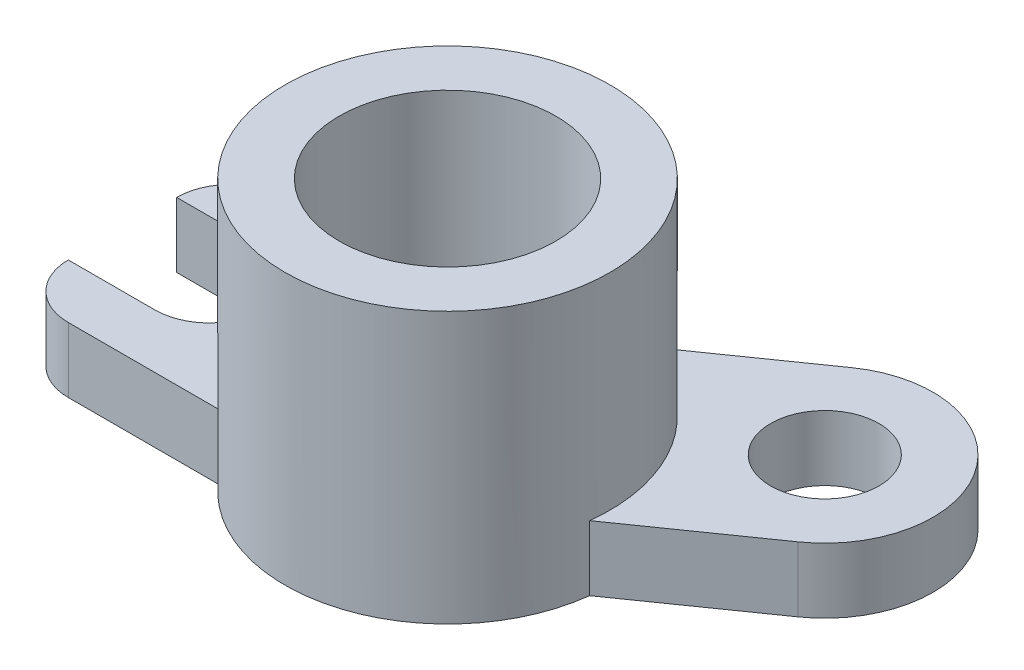
ISO-10303-21;
HEADER;
FILE_DESCRIPTION(('STEP AP214'),'2;1');
FILE_NAME('part.step','',(''),(''),'','','');
FILE_SCHEMA(('AUTOMOTIVE_DESIGN { 1 0 10303 214 1 1 1 1 }'));
ENDSEC;
DATA;
#1=APPLICATION_CONTEXT('core data for automotive mechanical design processes');
#2=APPLICATION_PROTOCOL_DEFINITION('international standard','automotive_design',2000,#1);
#3=PRODUCT_CONTEXT('',#1,'mechanical');
#4=PRODUCT('Part','Part','',(#3));
#5=PRODUCT_RELATED_PRODUCT_CATEGORY('part','',(#4));
#6=PRODUCT_DEFINITION_FORMATION('','',#4);
#7=PRODUCT_DEFINITION_CONTEXT('part definition',#1,'design');
#8=PRODUCT_DEFINITION('design','',#6,#7);
#9=PRODUCT_DEFINITION_SHAPE('','',#8);
#10=(LENGTH_UNIT() NAMED_UNIT(*) SI_UNIT(.MILLI.,.METRE.));
#11=(NAMED_UNIT(*) PLANE_ANGLE_UNIT() SI_UNIT($,.RADIAN.));
#12=(NAMED_UNIT(*) SI_UNIT($,.STERADIAN.) SOLID_ANGLE_UNIT());
#13=UNCERTAINTY_MEASURE_WITH_UNIT(LENGTH_MEASURE(1.E-05),#10,'distance_accuracy_value','');
#14=(GEOMETRIC_REPRESENTATION_CONTEXT(3) GLOBAL_UNCERTAINTY_ASSIGNED_CONTEXT((#13)) GLOBAL_UNIT_ASSIGNED_CONTEXT((#10,
#11,#12)) REPRESENTATION_CONTEXT('',''));
#15=CARTESIAN_POINT('',(0.,0.,0.));
#16=DIRECTION('',(0.,0.,1.));
#17=DIRECTION('',(1.,0.,0.));
#18=AXIS2_PLACEMENT_3D('',#15,#16,#17);
#19=CARTESIAN_POINT('',(0.,25.,0.));
#20=DIRECTION('',(0.,1.,0.));
#21=DIRECTION('',(0.,0.,1.));
#22=AXIS2_PLACEMENT_3D('',#19,#20,#21);
#23=PLANE('',#22);
#24=CARTESIAN_POINT('',(0.,25.,0.));
#25=DIRECTION('',(0.,1.,0.));
#26=DIRECTION('',(0.,0.,1.));
#27=AXIS2_PLACEMENT_3D('',#24,#25,#26);
#28=CIRCLE('',#27,15.);
#29=CARTESIAN_POINT('',(0.,25.,15.));
#30=VERTEX_POINT('',#29);
#31=EDGE_CURVE('E11',#30,#30,#28,.T.);
#32=ORIENTED_EDGE('',*,*,#31,.T.);
#33=EDGE_LOOP('',(#32));
#34=FACE_BOUND('',#33,.T.);
#35=CARTESIAN_POINT('',(0.,25.,0.));
#36=DIRECTION('',(0.,1.,0.));
#37=DIRECTION('',(0.,0.,1.));
#38=AXIS2_PLACEMENT_3D('',#35,#36,#37);
#39=CIRCLE('',#38,10.);
#40=CARTESIAN_POINT('',(0.,25.,10.));
#41=VERTEX_POINT('',#40);
#42=EDGE_CURVE('E218',#41,#41,#39,.T.);
#43=ORIENTED_EDGE('',*,*,#42,.F.);
#44=EDGE_LOOP('',(#43));
#45=FACE_BOUND('',#44,.T.);
#46=ADVANCED_FACE('F30',(#34,#45),#23,.T.);
#47=CARTESIAN_POINT('',(0.,0.,0.));
#48=DIRECTION('',(0.,1.,0.));
#49=DIRECTION('',(0.,0.,1.));
#50=AXIS2_PLACEMENT_3D('',#47,#48,#49);
#51=PLANE('',#50);
#52=CARTESIAN_POINT('',(0.,0.,0.));
#53=DIRECTION('',(0.,1.,0.));
#54=DIRECTION('',(0.,0.,1.));
#55=AXIS2_PLACEMENT_3D('',#52,#53,#54);
#56=CIRCLE('',#55,15.);
#57=CARTESIAN_POINT('',(-11.1803398874989,0.,10.));
#58=VERTEX_POINT('',#57);
#59=CARTESIAN_POINT('',(14.894162638201,0.,1.77874093302491));
#60=VERTEX_POINT('',#59);
#61=EDGE_CURVE('E34',#58,#60,#56,.T.);
#62=ORIENTED_EDGE('',*,*,#61,.F.);
#63=DIRECTION('',(-1.,0.,0.));
#64=VECTOR('',#63,1.);
#65=CARTESIAN_POINT('',(-58.8983487756243,0.,10.));
#66=LINE('',#65,#64);
#67=CARTESIAN_POINT('',(-25.,0.,10.));
#68=VERTEX_POINT('',#67);
#69=EDGE_CURVE('E190',#58,#68,#66,.T.);
#70=ORIENTED_EDGE('',*,*,#69,.T.);
#71=CARTESIAN_POINT('',(-25.,0.,5.));
#72=DIRECTION('',(0.,1.,0.));
#73=DIRECTION('',(0.,0.,1.));
#74=AXIS2_PLACEMENT_3D('',#71,#72,#73);
#75=CIRCLE('',#74,5.);
#76=CARTESIAN_POINT('',(-30.,0.,5.));
#77=VERTEX_POINT('',#76);
#78=EDGE_CURVE('E187',#68,#77,#75,.F.);
#79=ORIENTED_EDGE('',*,*,#78,.T.);
#80=DIRECTION('',(-1.,0.,0.));
#81=VECTOR('',#80,1.);
#82=CARTESIAN_POINT('',(-58.8983487756243,0.,5.));
#83=LINE('',#82,#81);
#84=CARTESIAN_POINT('',(-22.,0.,5.));
#85=VERTEX_POINT('',#84);
#86=EDGE_CURVE('E184',#85,#77,#83,.T.);
#87=ORIENTED_EDGE('',*,*,#86,.F.);
#88=CARTESIAN_POINT('',(-22.,0.,0.));
#89=DIRECTION('',(0.,1.,0.));
#90=DIRECTION('',(0.,0.,1.));
#91=AXIS2_PLACEMENT_3D('',#88,#89,#90);
#92=CIRCLE('',#91,5.);
#93=CARTESIAN_POINT('',(-22.,0.,-5.));
#94=VERTEX_POINT('',#93);
#95=EDGE_CURVE('E182',#94,#85,#92,.F.);
#96=ORIENTED_EDGE('',*,*,#95,.F.);
#97=DIRECTION('',(1.,0.,0.));
#98=VECTOR('',#97,1.);
#99=CARTESIAN_POINT('',(-58.8983487756243,0.,-4.99999999999999));
#100=LINE('',#99,#98);
#101=CARTESIAN_POINT('',(-30.,0.,-5.));
#102=VERTEX_POINT('',#101);
#103=EDGE_CURVE('E129',#102,#94,#100,.T.);
#104=ORIENTED_EDGE('',*,*,#103,.F.);
#105=CARTESIAN_POINT('',(-25.,0.,-5.));
#106=DIRECTION('',(0.,1.,0.));
#107=DIRECTION('',(0.,0.,1.));
#108=AXIS2_PLACEMENT_3D('',#105,#106,#107);
#109=CIRCLE('',#108,5.);
#110=CARTESIAN_POINT('',(-25.,0.,-9.99999999999999));
#111=VERTEX_POINT('',#110);
#112=EDGE_CURVE('E163',#111,#102,#109,.T.);
#113=ORIENTED_EDGE('',*,*,#112,.F.);
#114=DIRECTION('',(-1.,0.,0.));
#115=VECTOR('',#114,1.);
#116=CARTESIAN_POINT('',(-58.8983487756243,0.,-9.99999999999998));
#117=LINE('',#116,#115);
#118=CARTESIAN_POINT('',(-11.1803398874989,0.,-10.));
#119=VERTEX_POINT('',#118);
#120=EDGE_CURVE('E193',#119,#111,#117,.T.);
#121=ORIENTED_EDGE('',*,*,#120,.F.);
#122=CARTESIAN_POINT('',(3.42263391118014,0.,-14.604299952755));
#123=VERTEX_POINT('',#122);
#124=EDGE_CURVE('E221',#123,#119,#56,.T.);
#125=ORIENTED_EDGE('',*,*,#124,.F.);
#126=DIRECTION('',(0.819152044288995,0.,-0.573576436351042));
#127=VECTOR('',#126,1.);
#128=CARTESIAN_POINT('',(-40.5416270213267,0.,16.1798069640046));
#129=LINE('',#128,#127);
#130=CARTESIAN_POINT('',(14.7430367437145,0.,-22.530931351666));
#131=VERTEX_POINT('',#130);
#132=EDGE_CURVE('E151',#123,#131,#129,.T.);
#133=ORIENTED_EDGE('',*,*,#132,.T.);
#134=CARTESIAN_POINT('',(20.4788011072249,0.,-14.339410908776));
#135=DIRECTION('',(0.,1.,0.));
#136=DIRECTION('',(0.,0.,1.));
#137=AXIS2_PLACEMENT_3D('',#134,#135,#136);
#138=CIRCLE('',#137,10.);
#139=CARTESIAN_POINT('',(26.2145654707353,0.,-6.14789046588608));
#140=VERTEX_POINT('',#139);
#141=EDGE_CURVE('E124',#131,#140,#138,.F.);
#142=ORIENTED_EDGE('',*,*,#141,.T.);
#143=DIRECTION('',(-0.819152044288995,0.,0.573576436351042));
#144=VECTOR('',#143,1.);
#145=CARTESIAN_POINT('',(-29.0700982943059,0.,32.5628478497845));
#146=LINE('',#145,#144);
#147=EDGE_CURVE('E153',#140,#60,#146,.T.);
#148=ORIENTED_EDGE('',*,*,#147,.T.);
#149=EDGE_LOOP('',(#62,#70,#79,#87,#96,#104,#113,#121,#125,#133,#142,#148));
#150=FACE_BOUND('',#149,.T.);
#151=CARTESIAN_POINT('',(0.,0.,0.));
#152=DIRECTION('',(0.,1.,0.));
#153=DIRECTION('',(0.,0.,1.));
#154=AXIS2_PLACEMENT_3D('',#151,#152,#153);
#155=CIRCLE('',#154,10.);
#156=CARTESIAN_POINT('',(0.,0.,10.));
#157=VERTEX_POINT('',#156);
#158=EDGE_CURVE('E217',#157,#157,#155,.T.);
#159=ORIENTED_EDGE('',*,*,#158,.T.);
#160=EDGE_LOOP('',(#159));
#161=FACE_BOUND('',#160,.T.);
#162=CARTESIAN_POINT('',(20.4788011072249,0.,-14.339410908776));
#163=DIRECTION('',(0.,1.,0.));
#164=DIRECTION('',(0.,0.,1.));
#165=AXIS2_PLACEMENT_3D('',#162,#163,#164);
#166=CIRCLE('',#165,5.);
#167=CARTESIAN_POINT('',(20.4788011072249,0.,-9.33941090877604));
#168=VERTEX_POINT('',#167);
#169=EDGE_CURVE('E147',#168,#168,#166,.T.);
#170=ORIENTED_EDGE('',*,*,#169,.T.);
#171=EDGE_LOOP('',(#170));
#172=FACE_BOUND('',#171,.T.);
#173=ADVANCED_FACE('F225',(#150,#161,#172),#51,.F.);
#174=CARTESIAN_POINT('',(0.,25.,0.));
#175=DIRECTION('',(0.,-1.,0.));
#176=DIRECTION('',(0.,0.,-1.));
#177=AXIS2_PLACEMENT_3D('',#174,#175,#176);
#178=CYLINDRICAL_SURFACE('',#177,15.);
#179=CARTESIAN_POINT('',(0.,6.,0.));
#180=DIRECTION('',(0.,1.,0.));
#181=DIRECTION('',(0.,0.,1.));
#182=AXIS2_PLACEMENT_3D('',#179,#180,#181);
#183=CIRCLE('',#182,15.);
#184=CARTESIAN_POINT('',(14.894162638201,6.,1.77874093302491));
#185=VERTEX_POINT('',#184);
#186=CARTESIAN_POINT('',(3.42263391118014,6.,-14.604299952755));
#187=VERTEX_POINT('',#186);
#188=EDGE_CURVE('E45',#185,#187,#183,.T.);
#189=ORIENTED_EDGE('',*,*,#188,.T.);
#190=DIRECTION('',(0.,-1.,0.));
#191=VECTOR('',#190,1.);
#192=CARTESIAN_POINT('',(3.42263391118014,6.,-14.604299952755));
#193=LINE('',#192,#191);
#194=EDGE_CURVE('E130',#187,#123,#193,.T.);
#195=ORIENTED_EDGE('',*,*,#194,.T.);
#196=ORIENTED_EDGE('',*,*,#124,.T.);
#197=DIRECTION('',(0.,-1.,0.));
#198=VECTOR('',#197,1.);
#199=CARTESIAN_POINT('',(-11.180339887499,6.,-10.));
#200=LINE('',#199,#198);
#201=CARTESIAN_POINT('',(-11.180339887499,6.,-10.));
#202=VERTEX_POINT('',#201);
#203=EDGE_CURVE('E201',#202,#119,#200,.T.);
#204=ORIENTED_EDGE('',*,*,#203,.F.);
#205=CARTESIAN_POINT('',(0.,6.,0.));
#206=DIRECTION('',(0.,1.,0.));
#207=DIRECTION('',(0.,0.,1.));
#208=AXIS2_PLACEMENT_3D('',#205,#206,#207);
#209=CIRCLE('',#208,15.);
#210=CARTESIAN_POINT('',(-11.1803398874989,6.,10.));
#211=VERTEX_POINT('',#210);
#212=EDGE_CURVE('E173',#202,#211,#209,.T.);
#213=ORIENTED_EDGE('',*,*,#212,.T.);
#214=DIRECTION('',(0.,-1.,0.));
#215=VECTOR('',#214,1.);
#216=CARTESIAN_POINT('',(-11.1803398874989,6.,10.));
#217=LINE('',#216,#215);
#218=EDGE_CURVE('E204',#211,#58,#217,.T.);
#219=ORIENTED_EDGE('',*,*,#218,.T.);
#220=ORIENTED_EDGE('',*,*,#61,.T.);
#221=DIRECTION('',(0.,-1.,0.));
#222=VECTOR('',#221,1.);
#223=CARTESIAN_POINT('',(14.894162638201,6.,1.77874093302491));
#224=LINE('',#223,#222);
#225=EDGE_CURVE('E50',#185,#60,#224,.T.);
#226=ORIENTED_EDGE('',*,*,#225,.F.);
#227=EDGE_LOOP('',(#189,#195,#196,#204,#213,#219,#220,#226));
#228=FACE_BOUND('',#227,.T.);
#229=ORIENTED_EDGE('',*,*,#31,.F.);
#230=EDGE_LOOP('',(#229));
#231=FACE_BOUND('',#230,.T.);
#232=ADVANCED_FACE('F32',(#228,#231),#178,.T.);
#233=CARTESIAN_POINT('',(0.,25.,0.));
#234=DIRECTION('',(0.,-1.,0.));
#235=DIRECTION('',(0.,0.,-1.));
#236=AXIS2_PLACEMENT_3D('',#233,#234,#235);
#237=CYLINDRICAL_SURFACE('',#236,10.);
#238=ORIENTED_EDGE('',*,*,#42,.T.);
#239=EDGE_LOOP('',(#238));
#240=FACE_BOUND('',#239,.T.);
#241=ORIENTED_EDGE('',*,*,#158,.F.);
#242=EDGE_LOOP('',(#241));
#243=FACE_BOUND('',#242,.T.);
#244=ADVANCED_FACE('F228',(#240,#243),#237,.F.);
#245=CARTESIAN_POINT('',(-58.8983487756243,6.,-4.99999999999999));
#246=DIRECTION('',(0.,0.,-1.));
#247=DIRECTION('',(-1.,0.,0.));
#248=AXIS2_PLACEMENT_3D('',#245,#246,#247);
#249=PLANE('',#248);
#250=ORIENTED_EDGE('',*,*,#103,.T.);
#251=DIRECTION('',(0.,-1.,0.));
#252=VECTOR('',#251,1.);
#253=CARTESIAN_POINT('',(-22.,6.,-5.));
#254=LINE('',#253,#252);
#255=CARTESIAN_POINT('',(-22.,6.,-5.));
#256=VERTEX_POINT('',#255);
#257=EDGE_CURVE('E214',#256,#94,#254,.T.);
#258=ORIENTED_EDGE('',*,*,#257,.F.);
#259=DIRECTION('',(1.,0.,0.));
#260=VECTOR('',#259,1.);
#261=CARTESIAN_POINT('',(-58.8983487756243,6.,-4.99999999999999));
#262=LINE('',#261,#260);
#263=CARTESIAN_POINT('',(-30.,6.,-5.));
#264=VERTEX_POINT('',#263);
#265=EDGE_CURVE('E159',#264,#256,#262,.T.);
#266=ORIENTED_EDGE('',*,*,#265,.F.);
#267=DIRECTION('',(0.,-1.,0.));
#268=VECTOR('',#267,1.);
#269=CARTESIAN_POINT('',(-30.,6.,-5.));
#270=LINE('',#269,#268);
#271=EDGE_CURVE('E179',#264,#102,#270,.T.);
#272=ORIENTED_EDGE('',*,*,#271,.T.);
#273=EDGE_LOOP('',(#250,#258,#266,#272));
#274=FACE_BOUND('',#273,.T.);
#275=ADVANCED_FACE('F230',(#274),#249,.F.);
#276=CARTESIAN_POINT('',(-22.,6.,0.));
#277=DIRECTION('',(0.,-1.,0.));
#278=DIRECTION('',(0.,0.,-1.));
#279=AXIS2_PLACEMENT_3D('',#276,#277,#278);
#280=CYLINDRICAL_SURFACE('',#279,5.);
#281=ORIENTED_EDGE('',*,*,#95,.T.);
#282=DIRECTION('',(0.,-1.,0.));
#283=VECTOR('',#282,1.);
#284=CARTESIAN_POINT('',(-22.,6.,5.));
#285=LINE('',#284,#283);
#286=CARTESIAN_POINT('',(-22.,6.,5.));
#287=VERTEX_POINT('',#286);
#288=EDGE_CURVE('E211',#287,#85,#285,.T.);
#289=ORIENTED_EDGE('',*,*,#288,.F.);
#290=CARTESIAN_POINT('',(-22.,6.,0.));
#291=DIRECTION('',(0.,1.,0.));
#292=DIRECTION('',(0.,0.,1.));
#293=AXIS2_PLACEMENT_3D('',#290,#291,#292);
#294=CIRCLE('',#293,5.);
#295=EDGE_CURVE('E162',#256,#287,#294,.F.);
#296=ORIENTED_EDGE('',*,*,#295,.F.);
#297=ORIENTED_EDGE('',*,*,#257,.T.);
#298=EDGE_LOOP('',(#281,#289,#296,#297));
#299=FACE_BOUND('',#298,.T.);
#300=ADVANCED_FACE('F237',(#299),#280,.F.);
#301=CARTESIAN_POINT('',(-58.8983487756243,6.,5.));
#302=DIRECTION('',(0.,0.,1.));
#303=DIRECTION('',(1.,0.,0.));
#304=AXIS2_PLACEMENT_3D('',#301,#302,#303);
#305=PLANE('',#304);
#306=ORIENTED_EDGE('',*,*,#86,.T.);
#307=DIRECTION('',(0.,-1.,0.));
#308=VECTOR('',#307,1.);
#309=CARTESIAN_POINT('',(-30.,6.,5.));
#310=LINE('',#309,#308);
#311=CARTESIAN_POINT('',(-30.,6.,5.));
#312=VERTEX_POINT('',#311);
#313=EDGE_CURVE('E209',#312,#77,#310,.T.);
#314=ORIENTED_EDGE('',*,*,#313,.F.);
#315=DIRECTION('',(-1.,0.,0.));
#316=VECTOR('',#315,1.);
#317=CARTESIAN_POINT('',(-58.8983487756243,6.,5.));
#318=LINE('',#317,#316);
#319=EDGE_CURVE('E165',#287,#312,#318,.T.);
#320=ORIENTED_EDGE('',*,*,#319,.F.);
#321=ORIENTED_EDGE('',*,*,#288,.T.);
#322=EDGE_LOOP('',(#306,#314,#320,#321));
#323=FACE_BOUND('',#322,.T.);
#324=ADVANCED_FACE('F268',(#323),#305,.F.);
#325=CARTESIAN_POINT('',(-25.,6.,5.));
#326=DIRECTION('',(0.,-1.,0.));
#327=DIRECTION('',(0.,0.,-1.));
#328=AXIS2_PLACEMENT_3D('',#325,#326,#327);
#329=CYLINDRICAL_SURFACE('',#328,5.);
#330=ORIENTED_EDGE('',*,*,#78,.F.);
#331=DIRECTION('',(0.,-1.,0.));
#332=VECTOR('',#331,1.);
#333=CARTESIAN_POINT('',(-25.,6.,10.));
#334=LINE('',#333,#332);
#335=CARTESIAN_POINT('',(-25.,6.,10.));
#336=VERTEX_POINT('',#335);
#337=EDGE_CURVE('E207',#336,#68,#334,.T.);
#338=ORIENTED_EDGE('',*,*,#337,.F.);
#339=CARTESIAN_POINT('',(-25.,6.,5.));
#340=DIRECTION('',(0.,1.,0.));
#341=DIRECTION('',(0.,0.,1.));
#342=AXIS2_PLACEMENT_3D('',#339,#340,#341);
#343=CIRCLE('',#342,5.);
#344=EDGE_CURVE('E167',#336,#312,#343,.F.);
#345=ORIENTED_EDGE('',*,*,#344,.T.);
#346=ORIENTED_EDGE('',*,*,#313,.T.);
#347=EDGE_LOOP('',(#330,#338,#345,#346));
#348=FACE_BOUND('',#347,.T.);
#349=ADVANCED_FACE('F263',(#348),#329,.T.);
#350=CARTESIAN_POINT('',(-58.8983487756243,6.,10.));
#351=DIRECTION('',(0.,0.,1.));
#352=DIRECTION('',(1.,0.,0.));
#353=AXIS2_PLACEMENT_3D('',#350,#351,#352);
#354=PLANE('',#353);
#355=ORIENTED_EDGE('',*,*,#69,.F.);
#356=ORIENTED_EDGE('',*,*,#218,.F.);
#357=DIRECTION('',(-1.,0.,0.));
#358=VECTOR('',#357,1.);
#359=CARTESIAN_POINT('',(-58.8983487756243,6.,10.));
#360=LINE('',#359,#358);
#361=EDGE_CURVE('E170',#211,#336,#360,.T.);
#362=ORIENTED_EDGE('',*,*,#361,.T.);
#363=ORIENTED_EDGE('',*,*,#337,.T.);
#364=EDGE_LOOP('',(#355,#356,#362,#363));
#365=FACE_BOUND('',#364,.T.);
#366=ADVANCED_FACE('F259',(#365),#354,.T.);
#367=CARTESIAN_POINT('',(-58.8983487756243,6.,-9.99999999999998));
#368=DIRECTION('',(0.,0.,1.));
#369=DIRECTION('',(1.,0.,0.));
#370=AXIS2_PLACEMENT_3D('',#367,#368,#369);
#371=PLANE('',#370);
#372=ORIENTED_EDGE('',*,*,#120,.T.);
#373=DIRECTION('',(0.,-1.,0.));
#374=VECTOR('',#373,1.);
#375=CARTESIAN_POINT('',(-25.,6.,-9.99999999999999));
#376=LINE('',#375,#374);
#377=CARTESIAN_POINT('',(-25.,6.,-9.99999999999999));
#378=VERTEX_POINT('',#377);
#379=EDGE_CURVE('E198',#378,#111,#376,.T.);
#380=ORIENTED_EDGE('',*,*,#379,.F.);
#381=DIRECTION('',(-1.,0.,0.));
#382=VECTOR('',#381,1.);
#383=CARTESIAN_POINT('',(-58.8983487756243,6.,-9.99999999999998));
#384=LINE('',#383,#382);
#385=EDGE_CURVE('E175',#202,#378,#384,.T.);
#386=ORIENTED_EDGE('',*,*,#385,.F.);
#387=ORIENTED_EDGE('',*,*,#203,.T.);
#388=EDGE_LOOP('',(#372,#380,#386,#387));
#389=FACE_BOUND('',#388,.T.);
#390=ADVANCED_FACE('F283',(#389),#371,.F.);
#391=CARTESIAN_POINT('',(-25.,6.,-5.));
#392=DIRECTION('',(0.,-1.,0.));
#393=DIRECTION('',(0.,0.,-1.));
#394=AXIS2_PLACEMENT_3D('',#391,#392,#393);
#395=CYLINDRICAL_SURFACE('',#394,5.);
#396=ORIENTED_EDGE('',*,*,#112,.T.);
#397=ORIENTED_EDGE('',*,*,#271,.F.);
#398=CARTESIAN_POINT('',(-25.,6.,-5.));
#399=DIRECTION('',(0.,1.,0.));
#400=DIRECTION('',(0.,0.,1.));
#401=AXIS2_PLACEMENT_3D('',#398,#399,#400);
#402=CIRCLE('',#401,5.);
#403=EDGE_CURVE('E177',#378,#264,#402,.T.);
#404=ORIENTED_EDGE('',*,*,#403,.F.);
#405=ORIENTED_EDGE('',*,*,#379,.T.);
#406=EDGE_LOOP('',(#396,#397,#404,#405));
#407=FACE_BOUND('',#406,.T.);
#408=ADVANCED_FACE('F278',(#407),#395,.T.);
#409=CARTESIAN_POINT('',(-58.8983487756243,6.,-10.0363086197154));
#410=DIRECTION('',(0.,1.,0.));
#411=DIRECTION('',(0.,0.,1.));
#412=AXIS2_PLACEMENT_3D('',#409,#410,#411);
#413=PLANE('',#412);
#414=ORIENTED_EDGE('',*,*,#265,.T.);
#415=ORIENTED_EDGE('',*,*,#295,.T.);
#416=ORIENTED_EDGE('',*,*,#319,.T.);
#417=ORIENTED_EDGE('',*,*,#344,.F.);
#418=ORIENTED_EDGE('',*,*,#361,.F.);
#419=ORIENTED_EDGE('',*,*,#212,.F.);
#420=ORIENTED_EDGE('',*,*,#385,.T.);
#421=ORIENTED_EDGE('',*,*,#403,.T.);
#422=EDGE_LOOP('',(#414,#415,#416,#417,#418,#419,#420,#421));
#423=FACE_BOUND('',#422,.T.);
#424=ADVANCED_FACE('F301',(#423),#413,.T.);
#425=CARTESIAN_POINT('',(20.4788011072249,6.,-14.339410908776));
#426=DIRECTION('',(0.,-1.,0.));
#427=DIRECTION('',(0.,0.,-1.));
#428=AXIS2_PLACEMENT_3D('',#425,#426,#427);
#429=CYLINDRICAL_SURFACE('',#428,10.);
#430=ORIENTED_EDGE('',*,*,#141,.F.);
#431=DIRECTION('',(0.,-1.,0.));
#432=VECTOR('',#431,1.);
#433=CARTESIAN_POINT('',(14.7430367437145,6.,-22.530931351666));
#434=LINE('',#433,#432);
#435=CARTESIAN_POINT('',(14.7430367437145,6.,-22.530931351666));
#436=VERTEX_POINT('',#435);
#437=EDGE_CURVE('E118',#436,#131,#434,.T.);
#438=ORIENTED_EDGE('',*,*,#437,.F.);
#439=CARTESIAN_POINT('',(20.4788011072249,6.,-14.339410908776));
#440=DIRECTION('',(0.,1.,0.));
#441=DIRECTION('',(0.,0.,1.));
#442=AXIS2_PLACEMENT_3D('',#439,#440,#441);
#443=CIRCLE('',#442,10.);
#444=CARTESIAN_POINT('',(26.2145654707353,6.,-6.14789046588608));
#445=VERTEX_POINT('',#444);
#446=EDGE_CURVE('E121',#436,#445,#443,.F.);
#447=ORIENTED_EDGE('',*,*,#446,.T.);
#448=DIRECTION('',(0.,-1.,0.));
#449=VECTOR('',#448,1.);
#450=CARTESIAN_POINT('',(26.2145654707353,6.,-6.14789046588608));
#451=LINE('',#450,#449);
#452=EDGE_CURVE('E146',#445,#140,#451,.T.);
#453=ORIENTED_EDGE('',*,*,#452,.T.);
#454=EDGE_LOOP('',(#430,#438,#447,#453));
#455=FACE_BOUND('',#454,.T.);
#456=ADVANCED_FACE('F120',(#455),#429,.T.);
#457=CARTESIAN_POINT('',(-40.5416270213267,6.,16.1798069640046));
#458=DIRECTION('',(-0.573576436351042,0.,-0.819152044288995));
#459=DIRECTION('',(-0.819152044288995,0.,0.573576436351042));
#460=AXIS2_PLACEMENT_3D('',#457,#458,#459);
#461=PLANE('',#460);
#462=ORIENTED_EDGE('',*,*,#132,.F.);
#463=ORIENTED_EDGE('',*,*,#194,.F.);
#464=DIRECTION('',(0.819152044288995,0.,-0.573576436351042));
#465=VECTOR('',#464,1.);
#466=CARTESIAN_POINT('',(-40.5416270213267,6.,16.1798069640046));
#467=LINE('',#466,#465);
#468=EDGE_CURVE('E135',#187,#436,#467,.T.);
#469=ORIENTED_EDGE('',*,*,#468,.T.);
#470=ORIENTED_EDGE('',*,*,#437,.T.);
#471=EDGE_LOOP('',(#462,#463,#469,#470));
#472=FACE_BOUND('',#471,.T.);
#473=ADVANCED_FACE('F140',(#472),#461,.T.);
#474=CARTESIAN_POINT('',(20.4788011072249,6.,-14.339410908776));
#475=DIRECTION('',(0.,-1.,0.));
#476=DIRECTION('',(0.,0.,-1.));
#477=AXIS2_PLACEMENT_3D('',#474,#475,#476);
#478=CYLINDRICAL_SURFACE('',#477,5.);
#479=CARTESIAN_POINT('',(20.4788011072249,6.,-14.339410908776));
#480=DIRECTION('',(0.,1.,0.));
#481=DIRECTION('',(0.,0.,1.));
#482=AXIS2_PLACEMENT_3D('',#479,#480,#481);
#483=CIRCLE('',#482,5.);
#484=CARTESIAN_POINT('',(20.4788011072249,6.,-9.33941090877604));
#485=VERTEX_POINT('',#484);
#486=EDGE_CURVE('E138',#485,#485,#483,.T.);
#487=ORIENTED_EDGE('',*,*,#486,.T.);
#488=EDGE_LOOP('',(#487));
#489=FACE_BOUND('',#488,.T.);
#490=ORIENTED_EDGE('',*,*,#169,.F.);
#491=EDGE_LOOP('',(#490));
#492=FACE_BOUND('',#491,.T.);
#493=ADVANCED_FACE('F287',(#489,#492),#478,.F.);
#494=CARTESIAN_POINT('',(-29.0700982943059,6.,32.5628478497845));
#495=DIRECTION('',(0.573576436351042,0.,0.819152044288995));
#496=DIRECTION('',(0.819152044288995,0.,-0.573576436351042));
#497=AXIS2_PLACEMENT_3D('',#494,#495,#496);
#498=PLANE('',#497);
#499=ORIENTED_EDGE('',*,*,#147,.F.);
#500=ORIENTED_EDGE('',*,*,#452,.F.);
#501=DIRECTION('',(-0.819152044288995,0.,0.573576436351042));
#502=VECTOR('',#501,1.);
#503=CARTESIAN_POINT('',(-29.0700982943059,6.,32.5628478497845));
#504=LINE('',#503,#502);
#505=EDGE_CURVE('E137',#445,#185,#504,.T.);
#506=ORIENTED_EDGE('',*,*,#505,.T.);
#507=ORIENTED_EDGE('',*,*,#225,.T.);
#508=EDGE_LOOP('',(#499,#500,#506,#507));
#509=FACE_BOUND('',#508,.T.);
#510=ADVANCED_FACE('F285',(#509),#498,.T.);
#511=CARTESIAN_POINT('',(-58.8983487756243,6.,-10.0363086197154));
#512=DIRECTION('',(0.,1.,0.));
#513=DIRECTION('',(0.,0.,1.));
#514=AXIS2_PLACEMENT_3D('',#511,#512,#513);
#515=PLANE('',#514);
#516=ORIENTED_EDGE('',*,*,#486,.F.);
#517=EDGE_LOOP('',(#516));
#518=FACE_BOUND('',#517,.T.);
#519=ORIENTED_EDGE('',*,*,#446,.F.);
#520=ORIENTED_EDGE('',*,*,#468,.F.);
#521=ORIENTED_EDGE('',*,*,#188,.F.);
#522=ORIENTED_EDGE('',*,*,#505,.F.);
#523=EDGE_LOOP('',(#519,#520,#521,#522));
#524=FACE_BOUND('',#523,.T.);
#525=ADVANCED_FACE('F134',(#518,#524),#515,.T.);
#526=CLOSED_SHELL('',(#46,#173,#232,#244,#275,#300,#324,#349,#366,#390,#408,#424,#456,#473,#493,
#510,#525));
#527=MANIFOLD_SOLID_BREP('B2',#526);
#528=ADVANCED_BREP_SHAPE_REPRESENTATION('',(#18,#527),#14);
#529=SHAPE_DEFINITION_REPRESENTATION(#9,#528);
ENDSEC;
END-ISO-10303-21;
